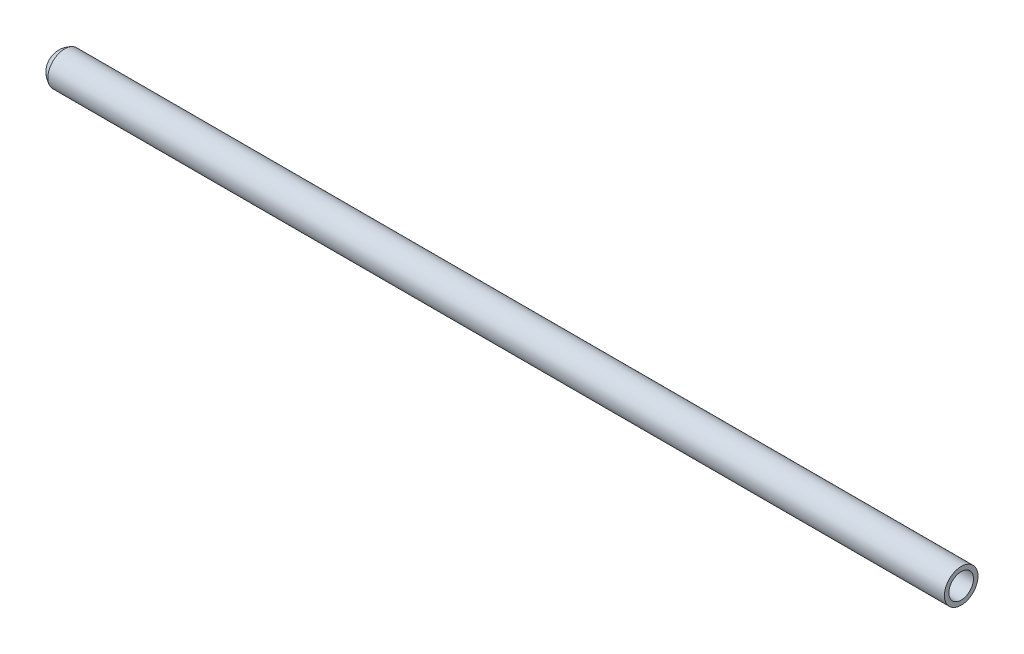
ISO-10303-21;
HEADER;
FILE_DESCRIPTION(('STEP AP214'),'2;1');
FILE_NAME('part.step','',(''),(''),'','','');
FILE_SCHEMA(('AUTOMOTIVE_DESIGN { 1 0 10303 214 1 1 1 1 }'));
ENDSEC;
DATA;
#1=APPLICATION_CONTEXT('core data for automotive mechanical design processes');
#2=APPLICATION_PROTOCOL_DEFINITION('international standard','automotive_design',2000,#1);
#3=PRODUCT_CONTEXT('',#1,'mechanical');
#4=PRODUCT('Part','Part','',(#3));
#5=PRODUCT_RELATED_PRODUCT_CATEGORY('part','',(#4));
#6=PRODUCT_DEFINITION_FORMATION('','',#4);
#7=PRODUCT_DEFINITION_CONTEXT('part definition',#1,'design');
#8=PRODUCT_DEFINITION('design','',#6,#7);
#9=PRODUCT_DEFINITION_SHAPE('','',#8);
#10=(LENGTH_UNIT() NAMED_UNIT(*) SI_UNIT(.MILLI.,.METRE.));
#11=(NAMED_UNIT(*) PLANE_ANGLE_UNIT() SI_UNIT($,.RADIAN.));
#12=(NAMED_UNIT(*) SI_UNIT($,.STERADIAN.) SOLID_ANGLE_UNIT());
#13=UNCERTAINTY_MEASURE_WITH_UNIT(LENGTH_MEASURE(1.E-05),#10,'distance_accuracy_value','');
#14=(GEOMETRIC_REPRESENTATION_CONTEXT(3) GLOBAL_UNCERTAINTY_ASSIGNED_CONTEXT((#13)) GLOBAL_UNIT_ASSIGNED_CONTEXT((#10,
#11,#12)) REPRESENTATION_CONTEXT('',''));
#15=CARTESIAN_POINT('',(0.,0.,0.));
#16=DIRECTION('',(0.,0.,1.));
#17=DIRECTION('',(1.,0.,0.));
#18=AXIS2_PLACEMENT_3D('',#15,#16,#17);
#19=CARTESIAN_POINT('',(-508.,0.,0.));
#20=DIRECTION('',(1.,0.,0.));
#21=DIRECTION('',(0.,0.,-1.));
#22=AXIS2_PLACEMENT_3D('',#19,#20,#21);
#23=CYLINDRICAL_SURFACE('',#22,9.525);
#24=CARTESIAN_POINT('',(-508.,0.,0.));
#25=DIRECTION('',(1.,0.,0.));
#26=DIRECTION('',(0.,0.,-1.));
#27=AXIS2_PLACEMENT_3D('',#24,#25,#26);
#28=CIRCLE('',#27,9.525);
#29=CARTESIAN_POINT('',(-508.,0.,-9.525));
#30=VERTEX_POINT('',#29);
#31=EDGE_CURVE('E10',#30,#30,#28,.T.);
#32=ORIENTED_EDGE('',*,*,#31,.T.);
#33=EDGE_LOOP('',(#32));
#34=FACE_BOUND('',#33,.T.);
#35=CARTESIAN_POINT('',(0.,0.,0.));
#36=DIRECTION('',(1.,0.,0.));
#37=DIRECTION('',(0.,0.,-1.));
#38=AXIS2_PLACEMENT_3D('',#35,#36,#37);
#39=CIRCLE('',#38,9.525);
#40=CARTESIAN_POINT('',(0.,0.,-9.525));
#41=VERTEX_POINT('',#40);
#42=EDGE_CURVE('E38',#41,#41,#39,.T.);
#43=ORIENTED_EDGE('',*,*,#42,.F.);
#44=EDGE_LOOP('',(#43));
#45=FACE_BOUND('',#44,.T.);
#46=ADVANCED_FACE('F31',(#34,#45),#23,.T.);
#47=CARTESIAN_POINT('',(-504.03125,0.,0.));
#48=DIRECTION('',(0.,0.,1.));
#49=DIRECTION('',(1.,0.,0.));
#50=AXIS2_PLACEMENT_3D('',#47,#48,#49);
#51=SPHERICAL_SURFACE('',#50,10.31875);
#52=CARTESIAN_POINT('',(-504.03125,0.,0.));
#53=DIRECTION('',(1.,0.,0.));
#54=DIRECTION('',(0.,0.,-1.));
#55=AXIS2_PLACEMENT_3D('',#52,#53,#54);
#56=SPHERICAL_SURFACE('',#55,10.31875);
#57=ORIENTED_EDGE('',*,*,#31,.F.);
#58=EDGE_LOOP('',(#57));
#59=FACE_BOUND('',#58,.T.);
#60=ADVANCED_FACE('F33',(#59),#56,.T.);
#61=CARTESIAN_POINT('',(0.,0.,0.));
#62=DIRECTION('',(1.,0.,0.));
#63=DIRECTION('',(0.,0.,-1.));
#64=AXIS2_PLACEMENT_3D('',#61,#62,#63);
#65=PLANE('',#64);
#66=CARTESIAN_POINT('',(0.,0.,0.));
#67=DIRECTION('',(1.,0.,0.));
#68=DIRECTION('',(0.,0.,-1.));
#69=AXIS2_PLACEMENT_3D('',#66,#67,#68);
#70=CIRCLE('',#69,6.985);
#71=CARTESIAN_POINT('',(0.,0.,-6.985));
#72=VERTEX_POINT('',#71);
#73=EDGE_CURVE('E46',#72,#72,#70,.T.);
#74=ORIENTED_EDGE('',*,*,#73,.F.);
#75=EDGE_LOOP('',(#74));
#76=FACE_BOUND('',#75,.T.);
#77=ORIENTED_EDGE('',*,*,#42,.T.);
#78=EDGE_LOOP('',(#77));
#79=FACE_BOUND('',#78,.T.);
#80=ADVANCED_FACE('F54',(#76,#79),#65,.T.);
#81=CARTESIAN_POINT('',(-508.,0.,0.));
#82=DIRECTION('',(1.,0.,0.));
#83=DIRECTION('',(0.,0.,-1.));
#84=AXIS2_PLACEMENT_3D('',#81,#82,#83);
#85=CYLINDRICAL_SURFACE('',#84,6.985);
#86=CARTESIAN_POINT('',(-507.45451256114,0.,0.));
#87=DIRECTION('',(1.00000000000001,0.,0.));
#88=DIRECTION('',(0.,0.,-1.));
#89=AXIS2_PLACEMENT_3D('',#86,#87,#88);
#90=CIRCLE('',#89,6.985);
#91=CARTESIAN_POINT('',(-507.45451256114,0.,-6.985));
#92=VERTEX_POINT('',#91);
#93=EDGE_CURVE('E42',#92,#92,#90,.T.);
#94=ORIENTED_EDGE('',*,*,#93,.F.);
#95=EDGE_LOOP('',(#94));
#96=FACE_BOUND('',#95,.T.);
#97=ORIENTED_EDGE('',*,*,#73,.T.);
#98=EDGE_LOOP('',(#97));
#99=FACE_BOUND('',#98,.T.);
#100=ADVANCED_FACE('F52',(#96,#99),#85,.F.);
#101=CARTESIAN_POINT('',(-504.03125,0.,0.));
#102=DIRECTION('',(0.,0.,1.));
#103=DIRECTION('',(1.,0.,0.));
#104=AXIS2_PLACEMENT_3D('',#101,#102,#103);
#105=SPHERICAL_SURFACE('',#104,7.77875000000002);
#106=CARTESIAN_POINT('',(-504.03125,0.,0.));
#107=DIRECTION('',(1.,0.,0.));
#108=DIRECTION('',(0.,0.,-1.));
#109=AXIS2_PLACEMENT_3D('',#106,#107,#108);
#110=SPHERICAL_SURFACE('',#109,7.77875000000002);
#111=ORIENTED_EDGE('',*,*,#93,.T.);
#112=EDGE_LOOP('',(#111));
#113=FACE_BOUND('',#112,.T.);
#114=ADVANCED_FACE('F61',(#113),#110,.F.);
#115=CLOSED_SHELL('',(#46,#60,#80,#100,#114));
#116=MANIFOLD_SOLID_BREP('B2',#115);
#117=ADVANCED_BREP_SHAPE_REPRESENTATION('',(#18,#116),#14);
#118=SHAPE_DEFINITION_REPRESENTATION(#9,#117);
ENDSEC;
END-ISO-10303-21;
